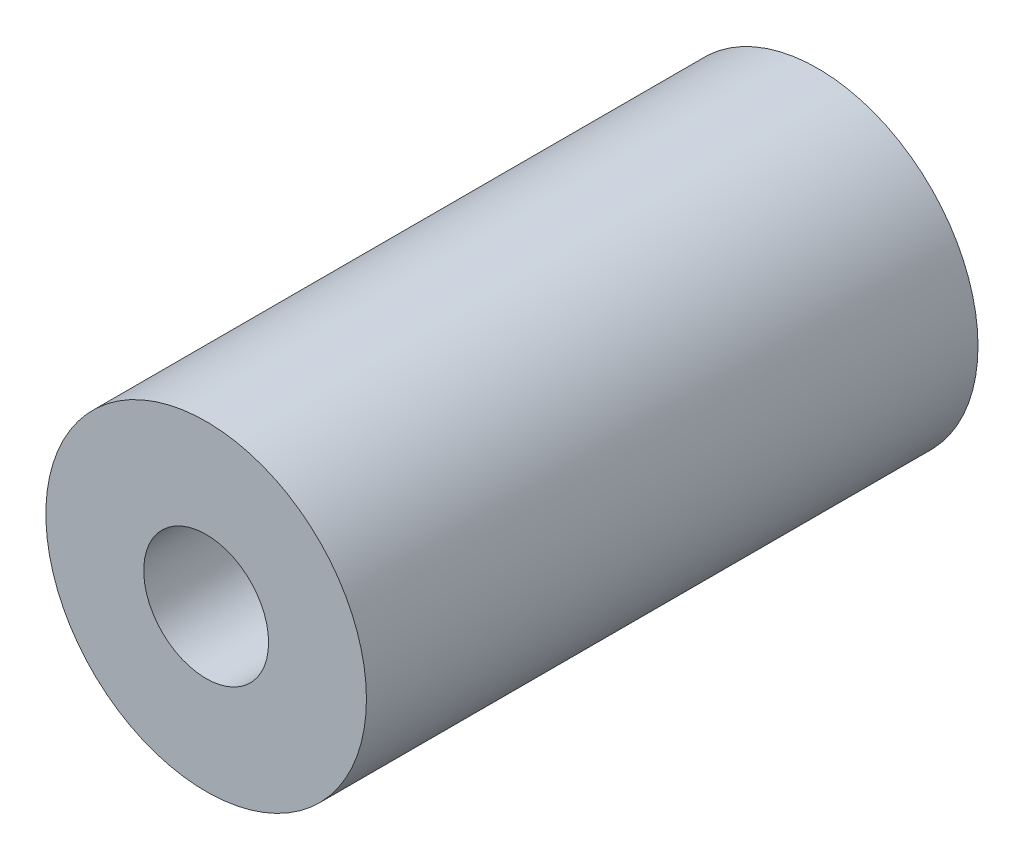
ISO-10303-21;
HEADER;
FILE_DESCRIPTION(('STEP AP214'),'2;1');
FILE_NAME('part.step','',(''),(''),'','','');
FILE_SCHEMA(('AUTOMOTIVE_DESIGN { 1 0 10303 214 1 1 1 1 }'));
ENDSEC;
DATA;
#1=APPLICATION_CONTEXT('core data for automotive mechanical design processes');
#2=APPLICATION_PROTOCOL_DEFINITION('international standard','automotive_design',2000,#1);
#3=PRODUCT_CONTEXT('',#1,'mechanical');
#4=PRODUCT('Part','Part','',(#3));
#5=PRODUCT_RELATED_PRODUCT_CATEGORY('part','',(#4));
#6=PRODUCT_DEFINITION_FORMATION('','',#4);
#7=PRODUCT_DEFINITION_CONTEXT('part definition',#1,'design');
#8=PRODUCT_DEFINITION('design','',#6,#7);
#9=PRODUCT_DEFINITION_SHAPE('','',#8);
#10=(LENGTH_UNIT() NAMED_UNIT(*) SI_UNIT(.MILLI.,.METRE.));
#11=(NAMED_UNIT(*) PLANE_ANGLE_UNIT() SI_UNIT($,.RADIAN.));
#12=(NAMED_UNIT(*) SI_UNIT($,.STERADIAN.) SOLID_ANGLE_UNIT());
#13=UNCERTAINTY_MEASURE_WITH_UNIT(LENGTH_MEASURE(1.E-05),#10,'distance_accuracy_value','');
#14=(GEOMETRIC_REPRESENTATION_CONTEXT(3) GLOBAL_UNCERTAINTY_ASSIGNED_CONTEXT((#13)) GLOBAL_UNIT_ASSIGNED_CONTEXT((#10,
#11,#12)) REPRESENTATION_CONTEXT('',''));
#15=CARTESIAN_POINT('',(0.,0.,0.));
#16=DIRECTION('',(0.,0.,1.));
#17=DIRECTION('',(1.,0.,0.));
#18=AXIS2_PLACEMENT_3D('',#15,#16,#17);
#19=CARTESIAN_POINT('',(0.,0.,12.5));
#20=DIRECTION('',(0.,0.,1.));
#21=DIRECTION('',(1.,0.,0.));
#22=AXIS2_PLACEMENT_3D('',#19,#20,#21);
#23=PLANE('',#22);
#24=CARTESIAN_POINT('',(0.,0.,12.5));
#25=DIRECTION('',(0.,0.,1.));
#26=DIRECTION('',(1.,0.,0.));
#27=AXIS2_PLACEMENT_3D('',#24,#25,#26);
#28=CIRCLE('',#27,6.5527);
#29=CARTESIAN_POINT('',(6.5527,0.,12.5));
#30=VERTEX_POINT('',#29);
#31=EDGE_CURVE('E10',#30,#30,#28,.T.);
#32=ORIENTED_EDGE('',*,*,#31,.T.);
#33=EDGE_LOOP('',(#32));
#34=FACE_BOUND('',#33,.T.);
#35=CARTESIAN_POINT('',(0.,0.,12.5));
#36=DIRECTION('',(0.,0.,1.));
#37=DIRECTION('',(1.,0.,0.));
#38=AXIS2_PLACEMENT_3D('',#35,#36,#37);
#39=CIRCLE('',#38,2.5527);
#40=CARTESIAN_POINT('',(2.5527,0.,12.5));
#41=VERTEX_POINT('',#40);
#42=EDGE_CURVE('E50',#41,#41,#39,.T.);
#43=ORIENTED_EDGE('',*,*,#42,.F.);
#44=EDGE_LOOP('',(#43));
#45=FACE_BOUND('',#44,.T.);
#46=ADVANCED_FACE('F37',(#34,#45),#23,.T.);
#47=CARTESIAN_POINT('',(0.,0.,-12.5));
#48=DIRECTION('',(0.,0.,1.));
#49=DIRECTION('',(1.,0.,0.));
#50=AXIS2_PLACEMENT_3D('',#47,#48,#49);
#51=PLANE('',#50);
#52=CARTESIAN_POINT('',(0.,0.,-12.5));
#53=DIRECTION('',(0.,0.,1.));
#54=DIRECTION('',(1.,0.,0.));
#55=AXIS2_PLACEMENT_3D('',#52,#53,#54);
#56=CIRCLE('',#55,6.5527);
#57=CARTESIAN_POINT('',(6.5527,0.,-12.5));
#58=VERTEX_POINT('',#57);
#59=EDGE_CURVE('E41',#58,#58,#56,.T.);
#60=ORIENTED_EDGE('',*,*,#59,.F.);
#61=EDGE_LOOP('',(#60));
#62=FACE_BOUND('',#61,.T.);
#63=CARTESIAN_POINT('',(0.,0.,-12.5));
#64=DIRECTION('',(0.,0.,1.));
#65=DIRECTION('',(1.,0.,0.));
#66=AXIS2_PLACEMENT_3D('',#63,#64,#65);
#67=CIRCLE('',#66,2.5527);
#68=CARTESIAN_POINT('',(2.5527,0.,-12.5));
#69=VERTEX_POINT('',#68);
#70=EDGE_CURVE('E52',#69,#69,#67,.T.);
#71=ORIENTED_EDGE('',*,*,#70,.T.);
#72=EDGE_LOOP('',(#71));
#73=FACE_BOUND('',#72,.T.);
#74=ADVANCED_FACE('F64',(#62,#73),#51,.F.);
#75=CARTESIAN_POINT('',(0.,0.,12.5));
#76=DIRECTION('',(0.,0.,-1.));
#77=DIRECTION('',(-1.,0.,0.));
#78=AXIS2_PLACEMENT_3D('',#75,#76,#77);
#79=CYLINDRICAL_SURFACE('',#78,6.5527);
#80=ORIENTED_EDGE('',*,*,#31,.F.);
#81=EDGE_LOOP('',(#80));
#82=FACE_BOUND('',#81,.T.);
#83=ORIENTED_EDGE('',*,*,#59,.T.);
#84=EDGE_LOOP('',(#83));
#85=FACE_BOUND('',#84,.T.);
#86=ADVANCED_FACE('F39',(#82,#85),#79,.T.);
#87=CARTESIAN_POINT('',(0.,0.,12.5));
#88=DIRECTION('',(0.,0.,-1.));
#89=DIRECTION('',(-1.,0.,0.));
#90=AXIS2_PLACEMENT_3D('',#87,#88,#89);
#91=CYLINDRICAL_SURFACE('',#90,2.5527);
#92=ORIENTED_EDGE('',*,*,#42,.T.);
#93=EDGE_LOOP('',(#92));
#94=FACE_BOUND('',#93,.T.);
#95=ORIENTED_EDGE('',*,*,#70,.F.);
#96=EDGE_LOOP('',(#95));
#97=FACE_BOUND('',#96,.T.);
#98=ADVANCED_FACE('F60',(#94,#97),#91,.F.);
#99=CLOSED_SHELL('',(#46,#74,#86,#98));
#100=MANIFOLD_SOLID_BREP('B2',#99);
#101=ADVANCED_BREP_SHAPE_REPRESENTATION('',(#18,#100),#14);
#102=SHAPE_DEFINITION_REPRESENTATION(#9,#101);
ENDSEC;
END-ISO-10303-21;
